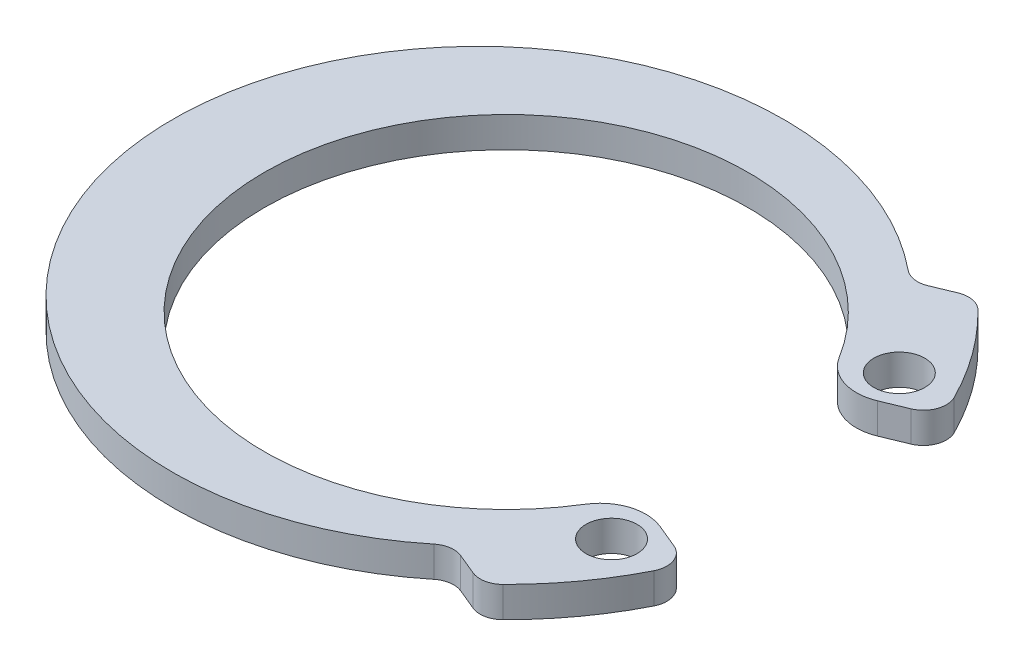
ISO-10303-21;
HEADER;
FILE_DESCRIPTION(('STEP AP214'),'2;1');
FILE_NAME('part.step','',(''),(''),'','','');
FILE_SCHEMA(('AUTOMOTIVE_DESIGN { 1 0 10303 214 1 1 1 1 }'));
ENDSEC;
DATA;
#1=APPLICATION_CONTEXT('core data for automotive mechanical design processes');
#2=APPLICATION_PROTOCOL_DEFINITION('international standard','automotive_design',2000,#1);
#3=PRODUCT_CONTEXT('',#1,'mechanical');
#4=PRODUCT('Part','Part','',(#3));
#5=PRODUCT_RELATED_PRODUCT_CATEGORY('part','',(#4));
#6=PRODUCT_DEFINITION_FORMATION('','',#4);
#7=PRODUCT_DEFINITION_CONTEXT('part definition',#1,'design');
#8=PRODUCT_DEFINITION('design','',#6,#7);
#9=PRODUCT_DEFINITION_SHAPE('','',#8);
#10=(LENGTH_UNIT() NAMED_UNIT(*) SI_UNIT(.MILLI.,.METRE.));
#11=(NAMED_UNIT(*) PLANE_ANGLE_UNIT() SI_UNIT($,.RADIAN.));
#12=(NAMED_UNIT(*) SI_UNIT($,.STERADIAN.) SOLID_ANGLE_UNIT());
#13=UNCERTAINTY_MEASURE_WITH_UNIT(LENGTH_MEASURE(1.E-05),#10,'distance_accuracy_value','');
#14=(GEOMETRIC_REPRESENTATION_CONTEXT(3) GLOBAL_UNCERTAINTY_ASSIGNED_CONTEXT((#13)) GLOBAL_UNIT_ASSIGNED_CONTEXT((#10,
#11,#12)) REPRESENTATION_CONTEXT('',''));
#15=CARTESIAN_POINT('',(0.,0.,0.));
#16=DIRECTION('',(0.,0.,1.));
#17=DIRECTION('',(1.,0.,0.));
#18=AXIS2_PLACEMENT_3D('',#15,#16,#17);
#19=CARTESIAN_POINT('',(4.28209468372585,0.3,4.34438316905942));
#20=DIRECTION('',(0.,1.,0.));
#21=DIRECTION('',(0.,0.,1.));
#22=AXIS2_PLACEMENT_3D('',#19,#20,#21);
#23=PLANE('',#22);
#24=CARTESIAN_POINT('',(4.89304353138207,0.3,2.82500000000001));
#25=DIRECTION('',(0.,1.,0.));
#26=DIRECTION('',(0.,0.,1.));
#27=AXIS2_PLACEMENT_3D('',#24,#25,#26);
#28=CIRCLE('',#27,0.5);
#29=CARTESIAN_POINT('',(4.89304353138207,0.3,3.32500000000001));
#30=VERTEX_POINT('',#29);
#31=EDGE_CURVE('E220',#30,#30,#28,.T.);
#32=ORIENTED_EDGE('',*,*,#31,.F.);
#33=EDGE_LOOP('',(#32));
#34=FACE_BOUND('',#33,.T.);
#35=CARTESIAN_POINT('',(4.28209468372585,0.3,4.34438316905942));
#36=DIRECTION('',(0.,1.,0.));
#37=DIRECTION('',(0.,0.,1.));
#38=AXIS2_PLACEMENT_3D('',#35,#36,#37);
#39=CIRCLE('',#38,0.45);
#40=CARTESIAN_POINT('',(4.10988713916156,0.3,4.7601289586895));
#41=VERTEX_POINT('',#40);
#42=CARTESIAN_POINT('',(4.59798691449251,0.3,4.66487045202282));
#43=VERTEX_POINT('',#42);
#44=EDGE_CURVE('E223',#41,#43,#39,.T.);
#45=ORIENTED_EDGE('',*,*,#44,.T.);
#46=CARTESIAN_POINT('',(0.,0.3,0.));
#47=DIRECTION('',(0.,1.,0.));
#48=DIRECTION('',(0.,0.,1.));
#49=AXIS2_PLACEMENT_3D('',#46,#47,#48);
#50=CIRCLE('',#49,6.55);
#51=CARTESIAN_POINT('',(5.85001094667601,0.3,2.94616223649868));
#52=VERTEX_POINT('',#51);
#53=EDGE_CURVE('E155',#43,#52,#50,.T.);
#54=ORIENTED_EDGE('',*,*,#53,.T.);
#55=CARTESIAN_POINT('',(5.44810179766773,0.3,2.7437541439148));
#56=DIRECTION('',(0.,1.,0.));
#57=DIRECTION('',(0.,0.,-1.));
#58=AXIS2_PLACEMENT_3D('',#55,#56,#57);
#59=CIRCLE('',#58,0.45);
#60=CARTESIAN_POINT('',(5.62030934223202,0.3,2.32800835428472));
#61=VERTEX_POINT('',#60);
#62=EDGE_CURVE('E226',#52,#61,#59,.T.);
#63=ORIENTED_EDGE('',*,*,#62,.T.);
#64=DIRECTION('',(-0.923879532511286,0.,-0.382683432365091));
#65=VECTOR('',#64,1.);
#66=CARTESIAN_POINT('',(5.15326885237256,0.3,2.13455384920756));
#67=LINE('',#66,#65);
#68=CARTESIAN_POINT('',(5.15326885237256,0.3,2.13455384920756));
#69=VERTEX_POINT('',#68);
#70=EDGE_CURVE('E228',#61,#69,#67,.T.);
#71=ORIENTED_EDGE('',*,*,#70,.T.);
#72=CARTESIAN_POINT('',(4.80885376324398,0.3,2.96604542846771));
#73=DIRECTION('',(0.,1.,0.));
#74=DIRECTION('',(0.,0.,1.));
#75=AXIS2_PLACEMENT_3D('',#72,#73,#74);
#76=CIRCLE('',#75,0.9);
#77=CARTESIAN_POINT('',(4.04284165936441,0.3,2.49357801508347));
#78=VERTEX_POINT('',#77);
#79=EDGE_CURVE('E230',#69,#78,#76,.T.);
#80=ORIENTED_EDGE('',*,*,#79,.T.);
#81=CARTESIAN_POINT('',(0.,0.3,0.));
#82=DIRECTION('',(0.,-1.,0.));
#83=DIRECTION('',(0.,0.,1.));
#84=AXIS2_PLACEMENT_3D('',#81,#82,#83);
#85=CIRCLE('',#84,4.75);
#86=CARTESIAN_POINT('',(4.04284165936441,0.3,-2.49357801508348));
#87=VERTEX_POINT('',#86);
#88=EDGE_CURVE('E232',#78,#87,#85,.T.);
#89=ORIENTED_EDGE('',*,*,#88,.T.);
#90=CARTESIAN_POINT('',(4.80885376324398,0.3,-2.96604542846771));
#91=DIRECTION('',(0.,1.,0.));
#92=DIRECTION('',(0.,0.,-1.));
#93=AXIS2_PLACEMENT_3D('',#90,#91,#92);
#94=CIRCLE('',#93,0.899999999999999);
#95=CARTESIAN_POINT('',(5.15326885237256,0.3,-2.13455384920756));
#96=VERTEX_POINT('',#95);
#97=EDGE_CURVE('E234',#87,#96,#94,.T.);
#98=ORIENTED_EDGE('',*,*,#97,.T.);
#99=DIRECTION('',(0.923879532511287,0.,-0.38268343236509));
#100=VECTOR('',#99,1.);
#101=CARTESIAN_POINT('',(5.15326885237256,0.3,-2.13455384920756));
#102=LINE('',#101,#100);
#103=CARTESIAN_POINT('',(5.62030934223202,0.3,-2.32800835428472));
#104=VERTEX_POINT('',#103);
#105=EDGE_CURVE('E236',#96,#104,#102,.T.);
#106=ORIENTED_EDGE('',*,*,#105,.T.);
#107=CARTESIAN_POINT('',(5.44810179766773,0.3,-2.7437541439148));
#108=DIRECTION('',(0.,1.,0.));
#109=DIRECTION('',(0.,0.,1.));
#110=AXIS2_PLACEMENT_3D('',#107,#108,#109);
#111=CIRCLE('',#110,0.45);
#112=CARTESIAN_POINT('',(5.85001094667601,0.3,-2.94616223649868));
#113=VERTEX_POINT('',#112);
#114=EDGE_CURVE('E238',#104,#113,#111,.T.);
#115=ORIENTED_EDGE('',*,*,#114,.T.);
#116=CARTESIAN_POINT('',(0.,0.3,0.));
#117=DIRECTION('',(0.,1.,0.));
#118=DIRECTION('',(0.,0.,-1.));
#119=AXIS2_PLACEMENT_3D('',#116,#117,#118);
#120=CIRCLE('',#119,6.55);
#121=CARTESIAN_POINT('',(4.59798691449251,0.3,-4.66487045202282));
#122=VERTEX_POINT('',#121);
#123=EDGE_CURVE('E240',#113,#122,#120,.T.);
#124=ORIENTED_EDGE('',*,*,#123,.T.);
#125=CARTESIAN_POINT('',(4.28209468372585,0.3,-4.34438316905942));
#126=DIRECTION('',(0.,1.,0.));
#127=DIRECTION('',(0.,0.,-1.));
#128=AXIS2_PLACEMENT_3D('',#125,#126,#127);
#129=CIRCLE('',#128,0.449999999999999);
#130=CARTESIAN_POINT('',(4.10988713916156,0.3,-4.7601289586895));
#131=VERTEX_POINT('',#130);
#132=EDGE_CURVE('E242',#122,#131,#129,.T.);
#133=ORIENTED_EDGE('',*,*,#132,.T.);
#134=DIRECTION('',(-0.923879532511287,0.,0.38268343236509));
#135=VECTOR('',#134,1.);
#136=CARTESIAN_POINT('',(3.69365894425914,0.3,-4.58772159531885));
#137=LINE('',#136,#135);
#138=CARTESIAN_POINT('',(3.69365894425914,0.3,-4.58772159531885));
#139=VERTEX_POINT('',#138);
#140=EDGE_CURVE('E244',#131,#139,#137,.T.);
#141=ORIENTED_EDGE('',*,*,#140,.T.);
#142=CARTESIAN_POINT('',(3.52145139969485,0.3,-5.00346738494892));
#143=DIRECTION('',(0.,-1.,0.));
#144=DIRECTION('',(0.,0.,1.));
#145=AXIS2_PLACEMENT_3D('',#142,#143,#144);
#146=CIRCLE('',#145,0.45);
#147=CARTESIAN_POINT('',(3.23744479467802,0.3,-4.65441115981203));
#148=VERTEX_POINT('',#147);
#149=EDGE_CURVE('E246',#139,#148,#146,.T.);
#150=ORIENTED_EDGE('',*,*,#149,.T.);
#151=CARTESIAN_POINT('',(-0.549576941812182,0.3,0.));
#152=DIRECTION('',(0.,1.,0.));
#153=DIRECTION('',(0.,0.,1.));
#154=AXIS2_PLACEMENT_3D('',#151,#152,#153);
#155=CIRCLE('',#154,6.00042305818782);
#156=CARTESIAN_POINT('',(3.23744479467802,0.3,4.65441115981203));
#157=VERTEX_POINT('',#156);
#158=EDGE_CURVE('E248',#148,#157,#155,.T.);
#159=ORIENTED_EDGE('',*,*,#158,.T.);
#160=CARTESIAN_POINT('',(3.52145139969485,0.3,5.00346738494892));
#161=DIRECTION('',(0.,-1.,0.));
#162=DIRECTION('',(0.,0.,-1.));
#163=AXIS2_PLACEMENT_3D('',#160,#161,#162);
#164=CIRCLE('',#163,0.450000000000001);
#165=CARTESIAN_POINT('',(3.69365894425914,0.3,4.58772159531884));
#166=VERTEX_POINT('',#165);
#167=EDGE_CURVE('E59',#157,#166,#164,.T.);
#168=ORIENTED_EDGE('',*,*,#167,.T.);
#169=DIRECTION('',(0.923879532511286,0.,0.382683432365092));
#170=VECTOR('',#169,1.);
#171=CARTESIAN_POINT('',(3.69365894425914,0.3,4.58772159531884));
#172=LINE('',#171,#170);
#173=EDGE_CURVE('E54',#166,#41,#172,.T.);
#174=ORIENTED_EDGE('',*,*,#173,.T.);
#175=EDGE_LOOP('',(#45,#54,#63,#71,#80,#89,#98,#106,#115,#124,#133,#141,#150,#159,#168,#174));
#176=FACE_BOUND('',#175,.T.);
#177=CARTESIAN_POINT('',(4.89304353138207,0.3,-2.82500000000001));
#178=DIRECTION('',(0.,1.,0.));
#179=DIRECTION('',(0.,0.,1.));
#180=AXIS2_PLACEMENT_3D('',#177,#178,#179);
#181=CIRCLE('',#180,0.5);
#182=CARTESIAN_POINT('',(4.89304353138207,0.3,-2.32500000000001));
#183=VERTEX_POINT('',#182);
#184=EDGE_CURVE('E217',#183,#183,#181,.T.);
#185=ORIENTED_EDGE('',*,*,#184,.F.);
#186=EDGE_LOOP('',(#185));
#187=FACE_BOUND('',#186,.T.);
#188=ADVANCED_FACE('F39',(#34,#176,#187),#23,.T.);
#189=CARTESIAN_POINT('',(4.28209468372585,0.3,4.34438316905942));
#190=DIRECTION('',(0.,-1.,0.));
#191=DIRECTION('',(0.,0.,-1.));
#192=AXIS2_PLACEMENT_3D('',#189,#190,#191);
#193=CYLINDRICAL_SURFACE('',#192,0.45);
#194=DIRECTION('',(0.,-1.,0.));
#195=VECTOR('',#194,1.);
#196=CARTESIAN_POINT('',(4.10988713916156,0.3,4.7601289586895));
#197=LINE('',#196,#195);
#198=CARTESIAN_POINT('',(4.10988713916156,-0.3,4.7601289586895));
#199=VERTEX_POINT('',#198);
#200=EDGE_CURVE('E170',#41,#199,#197,.T.);
#201=ORIENTED_EDGE('',*,*,#200,.T.);
#202=CARTESIAN_POINT('',(4.28209468372585,-0.3,4.34438316905942));
#203=DIRECTION('',(0.,1.,0.));
#204=DIRECTION('',(0.,0.,1.));
#205=AXIS2_PLACEMENT_3D('',#202,#203,#204);
#206=CIRCLE('',#205,0.45);
#207=CARTESIAN_POINT('',(4.59798691449251,-0.3,4.66487045202282));
#208=VERTEX_POINT('',#207);
#209=EDGE_CURVE('E164',#199,#208,#206,.T.);
#210=ORIENTED_EDGE('',*,*,#209,.T.);
#211=DIRECTION('',(0.,-1.,0.));
#212=VECTOR('',#211,1.);
#213=CARTESIAN_POINT('',(4.59798691449251,0.3,4.66487045202282));
#214=LINE('',#213,#212);
#215=EDGE_CURVE('E11',#43,#208,#214,.T.);
#216=ORIENTED_EDGE('',*,*,#215,.F.);
#217=ORIENTED_EDGE('',*,*,#44,.F.);
#218=EDGE_LOOP('',(#201,#210,#216,#217));
#219=FACE_BOUND('',#218,.T.);
#220=ADVANCED_FACE('F41',(#219),#193,.T.);
#221=CARTESIAN_POINT('',(0.,0.3,0.));
#222=DIRECTION('',(0.,-1.,0.));
#223=DIRECTION('',(0.,0.,-1.));
#224=AXIS2_PLACEMENT_3D('',#221,#222,#223);
#225=CYLINDRICAL_SURFACE('',#224,6.55);
#226=ORIENTED_EDGE('',*,*,#215,.T.);
#227=CARTESIAN_POINT('',(0.,-0.3,0.));
#228=DIRECTION('',(0.,1.,0.));
#229=DIRECTION('',(0.,0.,1.));
#230=AXIS2_PLACEMENT_3D('',#227,#228,#229);
#231=CIRCLE('',#230,6.55);
#232=CARTESIAN_POINT('',(5.85001094667601,-0.3,2.94616223649868));
#233=VERTEX_POINT('',#232);
#234=EDGE_CURVE('E154',#208,#233,#231,.T.);
#235=ORIENTED_EDGE('',*,*,#234,.T.);
#236=DIRECTION('',(0.,-1.,0.));
#237=VECTOR('',#236,1.);
#238=CARTESIAN_POINT('',(5.85001094667601,0.3,2.94616223649868));
#239=LINE('',#238,#237);
#240=EDGE_CURVE('E47',#52,#233,#239,.T.);
#241=ORIENTED_EDGE('',*,*,#240,.F.);
#242=ORIENTED_EDGE('',*,*,#53,.F.);
#243=EDGE_LOOP('',(#226,#235,#241,#242));
#244=FACE_BOUND('',#243,.T.);
#245=ADVANCED_FACE('F152',(#244),#225,.T.);
#246=CARTESIAN_POINT('',(5.44810179766773,0.3,2.7437541439148));
#247=DIRECTION('',(0.,-1.,0.));
#248=DIRECTION('',(0.,0.,-1.));
#249=AXIS2_PLACEMENT_3D('',#246,#247,#248);
#250=CYLINDRICAL_SURFACE('',#249,0.45);
#251=ORIENTED_EDGE('',*,*,#240,.T.);
#252=CARTESIAN_POINT('',(5.44810179766773,-0.3,2.7437541439148));
#253=DIRECTION('',(0.,1.,0.));
#254=DIRECTION('',(0.,0.,-1.));
#255=AXIS2_PLACEMENT_3D('',#252,#253,#254);
#256=CIRCLE('',#255,0.45);
#257=CARTESIAN_POINT('',(5.62030934223202,-0.3,2.32800835428472));
#258=VERTEX_POINT('',#257);
#259=EDGE_CURVE('E168',#233,#258,#256,.T.);
#260=ORIENTED_EDGE('',*,*,#259,.T.);
#261=DIRECTION('',(0.,-1.,0.));
#262=VECTOR('',#261,1.);
#263=CARTESIAN_POINT('',(5.62030934223202,0.3,2.32800835428472));
#264=LINE('',#263,#262);
#265=EDGE_CURVE('E277',#61,#258,#264,.T.);
#266=ORIENTED_EDGE('',*,*,#265,.F.);
#267=ORIENTED_EDGE('',*,*,#62,.F.);
#268=EDGE_LOOP('',(#251,#260,#266,#267));
#269=FACE_BOUND('',#268,.T.);
#270=ADVANCED_FACE('F280',(#269),#250,.T.);
#271=CARTESIAN_POINT('',(5.15326885237256,0.3,2.13455384920756));
#272=DIRECTION('',(-0.382683432365091,0.,0.923879532511286));
#273=DIRECTION('',(0.923879532511287,0.,0.382683432365091));
#274=AXIS2_PLACEMENT_3D('',#271,#272,#273);
#275=PLANE('',#274);
#276=ORIENTED_EDGE('',*,*,#265,.T.);
#277=DIRECTION('',(-0.923879532511286,0.,-0.382683432365091));
#278=VECTOR('',#277,1.);
#279=CARTESIAN_POINT('',(5.15326885237256,-0.3,2.13455384920756));
#280=LINE('',#279,#278);
#281=CARTESIAN_POINT('',(5.15326885237256,-0.3,2.13455384920756));
#282=VERTEX_POINT('',#281);
#283=EDGE_CURVE('E179',#258,#282,#280,.T.);
#284=ORIENTED_EDGE('',*,*,#283,.T.);
#285=DIRECTION('',(0.,-1.,0.));
#286=VECTOR('',#285,1.);
#287=CARTESIAN_POINT('',(5.15326885237256,0.3,2.13455384920756));
#288=LINE('',#287,#286);
#289=EDGE_CURVE('E275',#69,#282,#288,.T.);
#290=ORIENTED_EDGE('',*,*,#289,.F.);
#291=ORIENTED_EDGE('',*,*,#70,.F.);
#292=EDGE_LOOP('',(#276,#284,#290,#291));
#293=FACE_BOUND('',#292,.T.);
#294=ADVANCED_FACE('F288',(#293),#275,.F.);
#295=CARTESIAN_POINT('',(4.80885376324398,0.3,2.96604542846771));
#296=DIRECTION('',(0.,-1.,0.));
#297=DIRECTION('',(0.,0.,-1.));
#298=AXIS2_PLACEMENT_3D('',#295,#296,#297);
#299=CYLINDRICAL_SURFACE('',#298,0.9);
#300=ORIENTED_EDGE('',*,*,#289,.T.);
#301=CARTESIAN_POINT('',(4.80885376324398,-0.3,2.96604542846771));
#302=DIRECTION('',(0.,1.,0.));
#303=DIRECTION('',(0.,0.,1.));
#304=AXIS2_PLACEMENT_3D('',#301,#302,#303);
#305=CIRCLE('',#304,0.9);
#306=CARTESIAN_POINT('',(4.04284165936441,-0.3,2.49357801508347));
#307=VERTEX_POINT('',#306);
#308=EDGE_CURVE('E182',#282,#307,#305,.T.);
#309=ORIENTED_EDGE('',*,*,#308,.T.);
#310=DIRECTION('',(0.,-1.,0.));
#311=VECTOR('',#310,1.);
#312=CARTESIAN_POINT('',(4.04284165936441,0.3,2.49357801508347));
#313=LINE('',#312,#311);
#314=EDGE_CURVE('E273',#78,#307,#313,.T.);
#315=ORIENTED_EDGE('',*,*,#314,.F.);
#316=ORIENTED_EDGE('',*,*,#79,.F.);
#317=EDGE_LOOP('',(#300,#309,#315,#316));
#318=FACE_BOUND('',#317,.T.);
#319=ADVANCED_FACE('F291',(#318),#299,.T.);
#320=CARTESIAN_POINT('',(0.,0.3,0.));
#321=DIRECTION('',(0.,-1.,0.));
#322=DIRECTION('',(0.,0.,-1.));
#323=AXIS2_PLACEMENT_3D('',#320,#321,#322);
#324=CYLINDRICAL_SURFACE('',#323,4.75);
#325=ORIENTED_EDGE('',*,*,#314,.T.);
#326=CARTESIAN_POINT('',(0.,-0.3,0.));
#327=DIRECTION('',(0.,-1.,0.));
#328=DIRECTION('',(0.,0.,1.));
#329=AXIS2_PLACEMENT_3D('',#326,#327,#328);
#330=CIRCLE('',#329,4.75);
#331=CARTESIAN_POINT('',(4.04284165936441,-0.3,-2.49357801508348));
#332=VERTEX_POINT('',#331);
#333=EDGE_CURVE('E185',#307,#332,#330,.T.);
#334=ORIENTED_EDGE('',*,*,#333,.T.);
#335=DIRECTION('',(0.,-1.,0.));
#336=VECTOR('',#335,1.);
#337=CARTESIAN_POINT('',(4.04284165936441,0.3,-2.49357801508348));
#338=LINE('',#337,#336);
#339=EDGE_CURVE('E271',#87,#332,#338,.T.);
#340=ORIENTED_EDGE('',*,*,#339,.F.);
#341=ORIENTED_EDGE('',*,*,#88,.F.);
#342=EDGE_LOOP('',(#325,#334,#340,#341));
#343=FACE_BOUND('',#342,.T.);
#344=ADVANCED_FACE('F296',(#343),#324,.F.);
#345=CARTESIAN_POINT('',(4.80885376324398,0.3,-2.96604542846771));
#346=DIRECTION('',(0.,-1.,0.));
#347=DIRECTION('',(0.,0.,-1.));
#348=AXIS2_PLACEMENT_3D('',#345,#346,#347);
#349=CYLINDRICAL_SURFACE('',#348,0.899999999999999);
#350=ORIENTED_EDGE('',*,*,#339,.T.);
#351=CARTESIAN_POINT('',(4.80885376324398,-0.3,-2.96604542846771));
#352=DIRECTION('',(0.,1.,0.));
#353=DIRECTION('',(0.,0.,-1.));
#354=AXIS2_PLACEMENT_3D('',#351,#352,#353);
#355=CIRCLE('',#354,0.899999999999999);
#356=CARTESIAN_POINT('',(5.15326885237256,-0.3,-2.13455384920756));
#357=VERTEX_POINT('',#356);
#358=EDGE_CURVE('E188',#332,#357,#355,.T.);
#359=ORIENTED_EDGE('',*,*,#358,.T.);
#360=DIRECTION('',(0.,-1.,0.));
#361=VECTOR('',#360,1.);
#362=CARTESIAN_POINT('',(5.15326885237256,0.3,-2.13455384920756));
#363=LINE('',#362,#361);
#364=EDGE_CURVE('E269',#96,#357,#363,.T.);
#365=ORIENTED_EDGE('',*,*,#364,.F.);
#366=ORIENTED_EDGE('',*,*,#97,.F.);
#367=EDGE_LOOP('',(#350,#359,#365,#366));
#368=FACE_BOUND('',#367,.T.);
#369=ADVANCED_FACE('F302',(#368),#349,.T.);
#370=CARTESIAN_POINT('',(5.15326885237256,0.3,-2.13455384920756));
#371=DIRECTION('',(-0.38268343236509,0.,-0.923879532511287));
#372=DIRECTION('',(-0.923879532511287,0.,0.38268343236509));
#373=AXIS2_PLACEMENT_3D('',#370,#371,#372);
#374=PLANE('',#373);
#375=ORIENTED_EDGE('',*,*,#364,.T.);
#376=DIRECTION('',(0.923879532511287,0.,-0.38268343236509));
#377=VECTOR('',#376,1.);
#378=CARTESIAN_POINT('',(5.15326885237256,-0.3,-2.13455384920756));
#379=LINE('',#378,#377);
#380=CARTESIAN_POINT('',(5.62030934223202,-0.3,-2.32800835428472));
#381=VERTEX_POINT('',#380);
#382=EDGE_CURVE('E191',#357,#381,#379,.T.);
#383=ORIENTED_EDGE('',*,*,#382,.T.);
#384=DIRECTION('',(0.,-1.,0.));
#385=VECTOR('',#384,1.);
#386=CARTESIAN_POINT('',(5.62030934223202,0.3,-2.32800835428472));
#387=LINE('',#386,#385);
#388=EDGE_CURVE('E267',#104,#381,#387,.T.);
#389=ORIENTED_EDGE('',*,*,#388,.F.);
#390=ORIENTED_EDGE('',*,*,#105,.F.);
#391=EDGE_LOOP('',(#375,#383,#389,#390));
#392=FACE_BOUND('',#391,.T.);
#393=ADVANCED_FACE('F306',(#392),#374,.F.);
#394=CARTESIAN_POINT('',(5.44810179766773,0.3,-2.7437541439148));
#395=DIRECTION('',(0.,-1.,0.));
#396=DIRECTION('',(0.,0.,-1.));
#397=AXIS2_PLACEMENT_3D('',#394,#395,#396);
#398=CYLINDRICAL_SURFACE('',#397,0.45);
#399=ORIENTED_EDGE('',*,*,#388,.T.);
#400=CARTESIAN_POINT('',(5.44810179766773,-0.3,-2.7437541439148));
#401=DIRECTION('',(0.,1.,0.));
#402=DIRECTION('',(0.,0.,1.));
#403=AXIS2_PLACEMENT_3D('',#400,#401,#402);
#404=CIRCLE('',#403,0.45);
#405=CARTESIAN_POINT('',(5.85001094667601,-0.3,-2.94616223649868));
#406=VERTEX_POINT('',#405);
#407=EDGE_CURVE('E194',#381,#406,#404,.T.);
#408=ORIENTED_EDGE('',*,*,#407,.T.);
#409=DIRECTION('',(0.,-1.,0.));
#410=VECTOR('',#409,1.);
#411=CARTESIAN_POINT('',(5.85001094667601,0.3,-2.94616223649868));
#412=LINE('',#411,#410);
#413=EDGE_CURVE('E265',#113,#406,#412,.T.);
#414=ORIENTED_EDGE('',*,*,#413,.F.);
#415=ORIENTED_EDGE('',*,*,#114,.F.);
#416=EDGE_LOOP('',(#399,#408,#414,#415));
#417=FACE_BOUND('',#416,.T.);
#418=ADVANCED_FACE('F311',(#417),#398,.T.);
#419=CARTESIAN_POINT('',(0.,0.3,0.));
#420=DIRECTION('',(0.,-1.,0.));
#421=DIRECTION('',(0.,0.,-1.));
#422=AXIS2_PLACEMENT_3D('',#419,#420,#421);
#423=CYLINDRICAL_SURFACE('',#422,6.55);
#424=ORIENTED_EDGE('',*,*,#413,.T.);
#425=CARTESIAN_POINT('',(0.,-0.3,0.));
#426=DIRECTION('',(0.,1.,0.));
#427=DIRECTION('',(0.,0.,-1.));
#428=AXIS2_PLACEMENT_3D('',#425,#426,#427);
#429=CIRCLE('',#428,6.55);
#430=CARTESIAN_POINT('',(4.59798691449251,-0.3,-4.66487045202282));
#431=VERTEX_POINT('',#430);
#432=EDGE_CURVE('E197',#406,#431,#429,.T.);
#433=ORIENTED_EDGE('',*,*,#432,.T.);
#434=DIRECTION('',(0.,-1.,0.));
#435=VECTOR('',#434,1.);
#436=CARTESIAN_POINT('',(4.59798691449251,0.3,-4.66487045202282));
#437=LINE('',#436,#435);
#438=EDGE_CURVE('E263',#122,#431,#437,.T.);
#439=ORIENTED_EDGE('',*,*,#438,.F.);
#440=ORIENTED_EDGE('',*,*,#123,.F.);
#441=EDGE_LOOP('',(#424,#433,#439,#440));
#442=FACE_BOUND('',#441,.T.);
#443=ADVANCED_FACE('F317',(#442),#423,.T.);
#444=CARTESIAN_POINT('',(4.28209468372585,0.3,-4.34438316905942));
#445=DIRECTION('',(0.,-1.,0.));
#446=DIRECTION('',(0.,0.,-1.));
#447=AXIS2_PLACEMENT_3D('',#444,#445,#446);
#448=CYLINDRICAL_SURFACE('',#447,0.449999999999999);
#449=ORIENTED_EDGE('',*,*,#438,.T.);
#450=CARTESIAN_POINT('',(4.28209468372585,-0.3,-4.34438316905942));
#451=DIRECTION('',(0.,1.,0.));
#452=DIRECTION('',(0.,0.,-1.));
#453=AXIS2_PLACEMENT_3D('',#450,#451,#452);
#454=CIRCLE('',#453,0.449999999999999);
#455=CARTESIAN_POINT('',(4.10988713916156,-0.3,-4.7601289586895));
#456=VERTEX_POINT('',#455);
#457=EDGE_CURVE('E200',#431,#456,#454,.T.);
#458=ORIENTED_EDGE('',*,*,#457,.T.);
#459=DIRECTION('',(0.,-1.,0.));
#460=VECTOR('',#459,1.);
#461=CARTESIAN_POINT('',(4.10988713916156,0.3,-4.7601289586895));
#462=LINE('',#461,#460);
#463=EDGE_CURVE('E261',#131,#456,#462,.T.);
#464=ORIENTED_EDGE('',*,*,#463,.F.);
#465=ORIENTED_EDGE('',*,*,#132,.F.);
#466=EDGE_LOOP('',(#449,#458,#464,#465));
#467=FACE_BOUND('',#466,.T.);
#468=ADVANCED_FACE('F321',(#467),#448,.T.);
#469=CARTESIAN_POINT('',(3.69365894425914,0.3,-4.58772159531885));
#470=DIRECTION('',(0.38268343236509,0.,0.923879532511287));
#471=DIRECTION('',(0.923879532511287,0.,-0.38268343236509));
#472=AXIS2_PLACEMENT_3D('',#469,#470,#471);
#473=PLANE('',#472);
#474=ORIENTED_EDGE('',*,*,#463,.T.);
#475=DIRECTION('',(-0.923879532511287,0.,0.38268343236509));
#476=VECTOR('',#475,1.);
#477=CARTESIAN_POINT('',(3.69365894425914,-0.3,-4.58772159531885));
#478=LINE('',#477,#476);
#479=CARTESIAN_POINT('',(3.69365894425914,-0.3,-4.58772159531885));
#480=VERTEX_POINT('',#479);
#481=EDGE_CURVE('E203',#456,#480,#478,.T.);
#482=ORIENTED_EDGE('',*,*,#481,.T.);
#483=DIRECTION('',(0.,-1.,0.));
#484=VECTOR('',#483,1.);
#485=CARTESIAN_POINT('',(3.69365894425914,0.3,-4.58772159531885));
#486=LINE('',#485,#484);
#487=EDGE_CURVE('E259',#139,#480,#486,.T.);
#488=ORIENTED_EDGE('',*,*,#487,.F.);
#489=ORIENTED_EDGE('',*,*,#140,.F.);
#490=EDGE_LOOP('',(#474,#482,#488,#489));
#491=FACE_BOUND('',#490,.T.);
#492=ADVANCED_FACE('F326',(#491),#473,.F.);
#493=CARTESIAN_POINT('',(3.52145139969485,0.3,-5.00346738494892));
#494=DIRECTION('',(0.,-1.,0.));
#495=DIRECTION('',(0.,0.,-1.));
#496=AXIS2_PLACEMENT_3D('',#493,#494,#495);
#497=CYLINDRICAL_SURFACE('',#496,0.45);
#498=ORIENTED_EDGE('',*,*,#487,.T.);
#499=CARTESIAN_POINT('',(3.52145139969485,-0.3,-5.00346738494892));
#500=DIRECTION('',(0.,-1.,0.));
#501=DIRECTION('',(0.,0.,1.));
#502=AXIS2_PLACEMENT_3D('',#499,#500,#501);
#503=CIRCLE('',#502,0.45);
#504=CARTESIAN_POINT('',(3.23744479467802,-0.3,-4.65441115981203));
#505=VERTEX_POINT('',#504);
#506=EDGE_CURVE('E206',#480,#505,#503,.T.);
#507=ORIENTED_EDGE('',*,*,#506,.T.);
#508=DIRECTION('',(0.,-1.,0.));
#509=VECTOR('',#508,1.);
#510=CARTESIAN_POINT('',(3.23744479467802,0.3,-4.65441115981203));
#511=LINE('',#510,#509);
#512=EDGE_CURVE('E257',#148,#505,#511,.T.);
#513=ORIENTED_EDGE('',*,*,#512,.F.);
#514=ORIENTED_EDGE('',*,*,#149,.F.);
#515=EDGE_LOOP('',(#498,#507,#513,#514));
#516=FACE_BOUND('',#515,.T.);
#517=ADVANCED_FACE('F332',(#516),#497,.F.);
#518=CARTESIAN_POINT('',(-0.549576941812182,0.3,0.));
#519=DIRECTION('',(0.,-1.,0.));
#520=DIRECTION('',(0.,0.,-1.));
#521=AXIS2_PLACEMENT_3D('',#518,#519,#520);
#522=CYLINDRICAL_SURFACE('',#521,6.00042305818782);
#523=ORIENTED_EDGE('',*,*,#512,.T.);
#524=CARTESIAN_POINT('',(-0.549576941812182,-0.3,0.));
#525=DIRECTION('',(0.,1.,0.));
#526=DIRECTION('',(0.,0.,1.));
#527=AXIS2_PLACEMENT_3D('',#524,#525,#526);
#528=CIRCLE('',#527,6.00042305818782);
#529=CARTESIAN_POINT('',(3.23744479467802,-0.3,4.65441115981203));
#530=VERTEX_POINT('',#529);
#531=EDGE_CURVE('E209',#505,#530,#528,.T.);
#532=ORIENTED_EDGE('',*,*,#531,.T.);
#533=DIRECTION('',(0.,-1.,0.));
#534=VECTOR('',#533,1.);
#535=CARTESIAN_POINT('',(3.23744479467802,0.3,4.65441115981203));
#536=LINE('',#535,#534);
#537=EDGE_CURVE('E255',#157,#530,#536,.T.);
#538=ORIENTED_EDGE('',*,*,#537,.F.);
#539=ORIENTED_EDGE('',*,*,#158,.F.);
#540=EDGE_LOOP('',(#523,#532,#538,#539));
#541=FACE_BOUND('',#540,.T.);
#542=ADVANCED_FACE('F336',(#541),#522,.T.);
#543=CARTESIAN_POINT('',(3.52145139969485,0.3,5.00346738494892));
#544=DIRECTION('',(0.,-1.,0.));
#545=DIRECTION('',(0.,0.,-1.));
#546=AXIS2_PLACEMENT_3D('',#543,#544,#545);
#547=CYLINDRICAL_SURFACE('',#546,0.450000000000001);
#548=ORIENTED_EDGE('',*,*,#537,.T.);
#549=CARTESIAN_POINT('',(3.52145139969485,-0.3,5.00346738494892));
#550=DIRECTION('',(0.,-1.,0.));
#551=DIRECTION('',(0.,0.,-1.));
#552=AXIS2_PLACEMENT_3D('',#549,#550,#551);
#553=CIRCLE('',#552,0.450000000000001);
#554=CARTESIAN_POINT('',(3.69365894425914,-0.3,4.58772159531884));
#555=VERTEX_POINT('',#554);
#556=EDGE_CURVE('E212',#530,#555,#553,.T.);
#557=ORIENTED_EDGE('',*,*,#556,.T.);
#558=DIRECTION('',(0.,-1.,0.));
#559=VECTOR('',#558,1.);
#560=CARTESIAN_POINT('',(3.69365894425914,0.3,4.58772159531884));
#561=LINE('',#560,#559);
#562=EDGE_CURVE('E253',#166,#555,#561,.T.);
#563=ORIENTED_EDGE('',*,*,#562,.F.);
#564=ORIENTED_EDGE('',*,*,#167,.F.);
#565=EDGE_LOOP('',(#548,#557,#563,#564));
#566=FACE_BOUND('',#565,.T.);
#567=ADVANCED_FACE('F339',(#566),#547,.F.);
#568=CARTESIAN_POINT('',(3.69365894425914,0.3,4.58772159531884));
#569=DIRECTION('',(0.382683432365092,0.,-0.923879532511286));
#570=DIRECTION('',(-0.923879532511286,0.,-0.382683432365092));
#571=AXIS2_PLACEMENT_3D('',#568,#569,#570);
#572=PLANE('',#571);
#573=ORIENTED_EDGE('',*,*,#562,.T.);
#574=DIRECTION('',(0.923879532511286,0.,0.382683432365092));
#575=VECTOR('',#574,1.);
#576=CARTESIAN_POINT('',(3.69365894425914,-0.3,4.58772159531884));
#577=LINE('',#576,#575);
#578=EDGE_CURVE('E215',#555,#199,#577,.T.);
#579=ORIENTED_EDGE('',*,*,#578,.T.);
#580=ORIENTED_EDGE('',*,*,#200,.F.);
#581=ORIENTED_EDGE('',*,*,#173,.F.);
#582=EDGE_LOOP('',(#573,#579,#580,#581));
#583=FACE_BOUND('',#582,.T.);
#584=ADVANCED_FACE('F341',(#583),#572,.F.);
#585=CARTESIAN_POINT('',(4.89304353138207,0.3,2.82500000000001));
#586=DIRECTION('',(0.,-1.,0.));
#587=DIRECTION('',(0.,0.,-1.));
#588=AXIS2_PLACEMENT_3D('',#585,#586,#587);
#589=CYLINDRICAL_SURFACE('',#588,0.5);
#590=ORIENTED_EDGE('',*,*,#31,.T.);
#591=EDGE_LOOP('',(#590));
#592=FACE_BOUND('',#591,.T.);
#593=CARTESIAN_POINT('',(4.89304353138207,-0.3,2.82500000000001));
#594=DIRECTION('',(0.,1.,0.));
#595=DIRECTION('',(0.,0.,1.));
#596=AXIS2_PLACEMENT_3D('',#593,#594,#595);
#597=CIRCLE('',#596,0.5);
#598=CARTESIAN_POINT('',(4.89304353138207,-0.3,3.32500000000001));
#599=VERTEX_POINT('',#598);
#600=EDGE_CURVE('E171',#599,#599,#597,.T.);
#601=ORIENTED_EDGE('',*,*,#600,.F.);
#602=EDGE_LOOP('',(#601));
#603=FACE_BOUND('',#602,.T.);
#604=ADVANCED_FACE('F343',(#592,#603),#589,.F.);
#605=CARTESIAN_POINT('',(4.89304353138207,0.3,-2.82500000000001));
#606=DIRECTION('',(0.,-1.,0.));
#607=DIRECTION('',(0.,0.,-1.));
#608=AXIS2_PLACEMENT_3D('',#605,#606,#607);
#609=CYLINDRICAL_SURFACE('',#608,0.5);
#610=ORIENTED_EDGE('',*,*,#184,.T.);
#611=EDGE_LOOP('',(#610));
#612=FACE_BOUND('',#611,.T.);
#613=CARTESIAN_POINT('',(4.89304353138207,-0.3,-2.82500000000001));
#614=DIRECTION('',(0.,1.,0.));
#615=DIRECTION('',(0.,0.,1.));
#616=AXIS2_PLACEMENT_3D('',#613,#614,#615);
#617=CIRCLE('',#616,0.5);
#618=CARTESIAN_POINT('',(4.89304353138207,-0.3,-2.32500000000001));
#619=VERTEX_POINT('',#618);
#620=EDGE_CURVE('E174',#619,#619,#617,.T.);
#621=ORIENTED_EDGE('',*,*,#620,.F.);
#622=EDGE_LOOP('',(#621));
#623=FACE_BOUND('',#622,.T.);
#624=ADVANCED_FACE('F349',(#612,#623),#609,.F.);
#625=CARTESIAN_POINT('',(4.28209468372585,-0.3,4.34438316905942));
#626=DIRECTION('',(0.,1.,0.));
#627=DIRECTION('',(0.,0.,1.));
#628=AXIS2_PLACEMENT_3D('',#625,#626,#627);
#629=PLANE('',#628);
#630=ORIENTED_EDGE('',*,*,#620,.T.);
#631=EDGE_LOOP('',(#630));
#632=FACE_BOUND('',#631,.T.);
#633=ORIENTED_EDGE('',*,*,#600,.T.);
#634=EDGE_LOOP('',(#633));
#635=FACE_BOUND('',#634,.T.);
#636=ORIENTED_EDGE('',*,*,#209,.F.);
#637=ORIENTED_EDGE('',*,*,#578,.F.);
#638=ORIENTED_EDGE('',*,*,#556,.F.);
#639=ORIENTED_EDGE('',*,*,#531,.F.);
#640=ORIENTED_EDGE('',*,*,#506,.F.);
#641=ORIENTED_EDGE('',*,*,#481,.F.);
#642=ORIENTED_EDGE('',*,*,#457,.F.);
#643=ORIENTED_EDGE('',*,*,#432,.F.);
#644=ORIENTED_EDGE('',*,*,#407,.F.);
#645=ORIENTED_EDGE('',*,*,#382,.F.);
#646=ORIENTED_EDGE('',*,*,#358,.F.);
#647=ORIENTED_EDGE('',*,*,#333,.F.);
#648=ORIENTED_EDGE('',*,*,#308,.F.);
#649=ORIENTED_EDGE('',*,*,#283,.F.);
#650=ORIENTED_EDGE('',*,*,#259,.F.);
#651=ORIENTED_EDGE('',*,*,#234,.F.);
#652=EDGE_LOOP('',(#636,#637,#638,#639,#640,#641,#642,#643,#644,#645,#646,#647,#648,#649,#650,#651));
#653=FACE_BOUND('',#652,.T.);
#654=ADVANCED_FACE('F162',(#632,#635,#653),#629,.F.);
#655=CLOSED_SHELL('',(#188,#220,#245,#270,#294,#319,#344,#369,#393,#418,#443,#468,#492,#517,
#542,#567,#584,#604,#624,#654));
#656=MANIFOLD_SOLID_BREP('B2',#655);
#657=ADVANCED_BREP_SHAPE_REPRESENTATION('',(#18,#656),#14);
#658=SHAPE_DEFINITION_REPRESENTATION(#9,#657);
ENDSEC;
END-ISO-10303-21;
